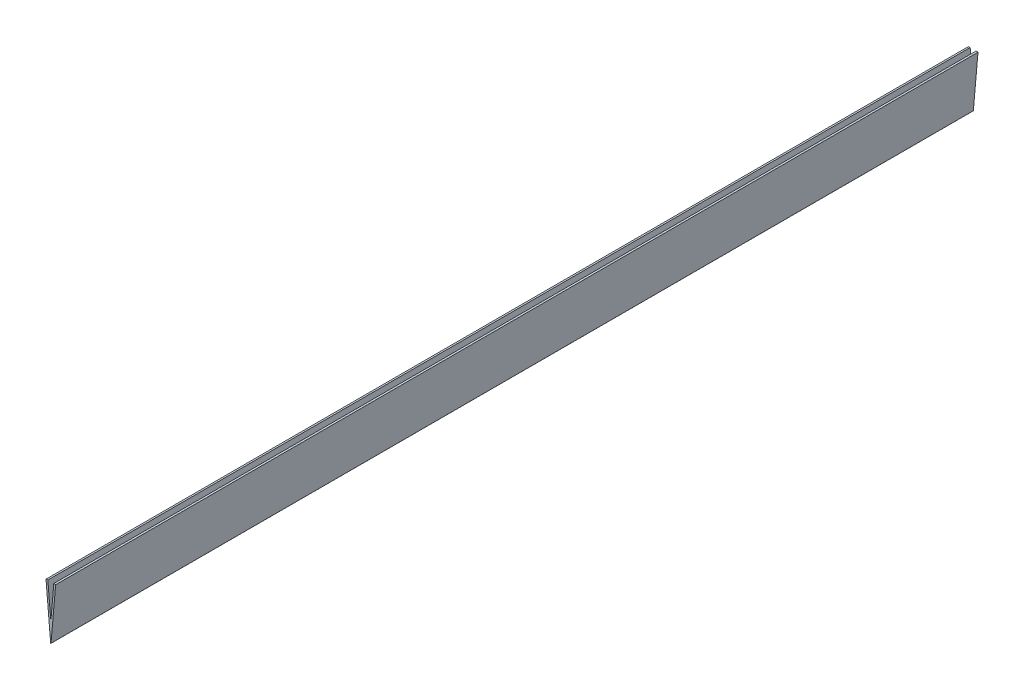
ISO-10303-21;
HEADER;
FILE_DESCRIPTION(('STEP AP214'),'2;1');
FILE_NAME('part.step','',(''),(''),'','','');
FILE_SCHEMA(('AUTOMOTIVE_DESIGN { 1 0 10303 214 1 1 1 1 }'));
ENDSEC;
DATA;
#1=APPLICATION_CONTEXT('core data for automotive mechanical design processes');
#2=APPLICATION_PROTOCOL_DEFINITION('international standard','automotive_design',2000,#1);
#3=PRODUCT_CONTEXT('',#1,'mechanical');
#4=PRODUCT('Part','Part','',(#3));
#5=PRODUCT_RELATED_PRODUCT_CATEGORY('part','',(#4));
#6=PRODUCT_DEFINITION_FORMATION('','',#4);
#7=PRODUCT_DEFINITION_CONTEXT('part definition',#1,'design');
#8=PRODUCT_DEFINITION('design','',#6,#7);
#9=PRODUCT_DEFINITION_SHAPE('','',#8);
#10=(LENGTH_UNIT() NAMED_UNIT(*) SI_UNIT(.MILLI.,.METRE.));
#11=(NAMED_UNIT(*) PLANE_ANGLE_UNIT() SI_UNIT($,.RADIAN.));
#12=(NAMED_UNIT(*) SI_UNIT($,.STERADIAN.) SOLID_ANGLE_UNIT());
#13=UNCERTAINTY_MEASURE_WITH_UNIT(LENGTH_MEASURE(1.E-05),#10,'distance_accuracy_value','');
#14=(GEOMETRIC_REPRESENTATION_CONTEXT(3) GLOBAL_UNCERTAINTY_ASSIGNED_CONTEXT((#13)) GLOBAL_UNIT_ASSIGNED_CONTEXT((#10,
#11,#12)) REPRESENTATION_CONTEXT('',''));
#15=CARTESIAN_POINT('',(0.,0.,0.));
#16=DIRECTION('',(0.,0.,1.));
#17=DIRECTION('',(1.,0.,0.));
#18=AXIS2_PLACEMENT_3D('',#15,#16,#17);
#19=CARTESIAN_POINT('',(-0.261467228242975,1.84121276970825,50.));
#20=DIRECTION('',(0.996194698091745,0.0871557427476585,0.));
#21=DIRECTION('',(-0.0871557427476585,0.996194698091746,0.));
#22=AXIS2_PLACEMENT_3D('',#19,#20,#21);
#23=PLANE('',#22);
#24=DIRECTION('',(0.0871557427476585,-0.996194698091746,0.));
#25=VECTOR('',#24,1.);
#26=CARTESIAN_POINT('',(-0.261467228242975,1.84121276970825,0.));
#27=LINE('',#26,#25);
#28=CARTESIAN_POINT('',(-0.261467228242975,1.84121276970825,0.));
#29=VERTEX_POINT('',#28);
#30=CARTESIAN_POINT('',(-0.00996194698091725,-1.03350574953776,0.));
#31=VERTEX_POINT('',#30);
#32=EDGE_CURVE('E141',#29,#31,#27,.T.);
#33=ORIENTED_EDGE('',*,*,#32,.T.);
#34=DIRECTION('',(0.,0.,-1.));
#35=VECTOR('',#34,1.);
#36=CARTESIAN_POINT('',(-0.00996194698091736,-1.03350574953776,50.));
#37=LINE('',#36,#35);
#38=CARTESIAN_POINT('',(-0.00996194698091725,-1.03350574953776,50.));
#39=VERTEX_POINT('',#38);
#40=EDGE_CURVE('E162',#31,#39,#37,.F.);
#41=ORIENTED_EDGE('',*,*,#40,.T.);
#42=DIRECTION('',(0.0871557427476585,-0.996194698091746,0.));
#43=VECTOR('',#42,1.);
#44=CARTESIAN_POINT('',(-0.261467228242975,1.84121276970825,50.));
#45=LINE('',#44,#43);
#46=CARTESIAN_POINT('',(-0.261467228242975,1.84121276970825,50.));
#47=VERTEX_POINT('',#46);
#48=EDGE_CURVE('E116',#47,#39,#45,.T.);
#49=ORIENTED_EDGE('',*,*,#48,.F.);
#50=DIRECTION('',(0.,0.,-1.));
#51=VECTOR('',#50,1.);
#52=CARTESIAN_POINT('',(-0.261467228242975,1.84121276970825,50.));
#53=LINE('',#52,#51);
#54=EDGE_CURVE('E140',#47,#29,#53,.T.);
#55=ORIENTED_EDGE('',*,*,#54,.T.);
#56=EDGE_LOOP('',(#33,#41,#49,#55));
#57=FACE_BOUND('',#56,.T.);
#58=ADVANCED_FACE('F41',(#57),#23,.F.);
#59=CARTESIAN_POINT('',(0.,-1.14737132456698,50.));
#60=DIRECTION('',(-0.996194698091745,0.0871557427476582,0.));
#61=DIRECTION('',(-0.0871557427476583,-0.996194698091746,0.));
#62=AXIS2_PLACEMENT_3D('',#59,#60,#61);
#63=PLANE('',#62);
#64=DIRECTION('',(0.0871557427476583,0.996194698091746,0.));
#65=VECTOR('',#64,1.);
#66=CARTESIAN_POINT('',(0.,-1.14737132456698,50.));
#67=LINE('',#66,#65);
#68=CARTESIAN_POINT('',(0.00996194698091756,-1.03350574953776,50.));
#69=VERTEX_POINT('',#68);
#70=CARTESIAN_POINT('',(0.261467228242975,1.84121276970825,50.));
#71=VERTEX_POINT('',#70);
#72=EDGE_CURVE('E104',#69,#71,#67,.T.);
#73=ORIENTED_EDGE('',*,*,#72,.F.);
#74=DIRECTION('',(0.,0.,-1.));
#75=VECTOR('',#74,1.);
#76=CARTESIAN_POINT('',(0.00996194698091756,-1.03350574953776,50.));
#77=LINE('',#76,#75);
#78=CARTESIAN_POINT('',(0.00996194698091756,-1.03350574953776,0.));
#79=VERTEX_POINT('',#78);
#80=EDGE_CURVE('E126',#69,#79,#77,.T.);
#81=ORIENTED_EDGE('',*,*,#80,.T.);
#82=DIRECTION('',(0.0871557427476583,0.996194698091746,0.));
#83=VECTOR('',#82,1.);
#84=CARTESIAN_POINT('',(0.,-1.14737132456698,0.));
#85=LINE('',#84,#83);
#86=CARTESIAN_POINT('',(0.261467228242975,1.84121276970825,0.));
#87=VERTEX_POINT('',#86);
#88=EDGE_CURVE('E122',#79,#87,#85,.T.);
#89=ORIENTED_EDGE('',*,*,#88,.T.);
#90=DIRECTION('',(0.,0.,-1.));
#91=VECTOR('',#90,1.);
#92=CARTESIAN_POINT('',(0.261467228242975,1.84121276970825,50.));
#93=LINE('',#92,#91);
#94=EDGE_CURVE('E119',#71,#87,#93,.T.);
#95=ORIENTED_EDGE('',*,*,#94,.F.);
#96=EDGE_LOOP('',(#73,#81,#89,#95));
#97=FACE_BOUND('',#96,.T.);
#98=ADVANCED_FACE('F120',(#97),#63,.F.);
#99=CARTESIAN_POINT('',(0.261467228242975,1.84121276970825,50.));
#100=DIRECTION('',(-0.0871557427476583,-0.996194698091746,0.));
#101=DIRECTION('',(0.996194698091746,-0.0871557427476583,0.));
#102=AXIS2_PLACEMENT_3D('',#99,#100,#101);
#103=PLANE('',#102);
#104=DIRECTION('',(-0.996194698091746,0.0871557427476583,0.));
#105=VECTOR('',#104,1.);
#106=CARTESIAN_POINT('',(0.261467228242975,1.84121276970825,0.));
#107=LINE('',#106,#105);
#108=CARTESIAN_POINT('',(0.1618477584338,1.84992834398302,0.));
#109=VERTEX_POINT('',#108);
#110=EDGE_CURVE('E145',#87,#109,#107,.T.);
#111=ORIENTED_EDGE('',*,*,#110,.T.);
#112=DIRECTION('',(0.,0.,-1.));
#113=VECTOR('',#112,1.);
#114=CARTESIAN_POINT('',(0.1618477584338,1.84992834398302,50.));
#115=LINE('',#114,#113);
#116=CARTESIAN_POINT('',(0.1618477584338,1.84992834398302,50.));
#117=VERTEX_POINT('',#116);
#118=EDGE_CURVE('E127',#117,#109,#115,.T.);
#119=ORIENTED_EDGE('',*,*,#118,.F.);
#120=DIRECTION('',(-0.996194698091746,0.0871557427476583,0.));
#121=VECTOR('',#120,1.);
#122=CARTESIAN_POINT('',(0.261467228242975,1.84121276970825,50.));
#123=LINE('',#122,#121);
#124=EDGE_CURVE('E109',#71,#117,#123,.T.);
#125=ORIENTED_EDGE('',*,*,#124,.F.);
#126=ORIENTED_EDGE('',*,*,#94,.T.);
#127=EDGE_LOOP('',(#111,#119,#125,#126));
#128=FACE_BOUND('',#127,.T.);
#129=ADVANCED_FACE('F129',(#128),#103,.F.);
#130=CARTESIAN_POINT('',(0.,0.,50.));
#131=DIRECTION('',(-0.996194698091746,0.0871557427476582,0.));
#132=DIRECTION('',(-0.0871557427476582,-0.996194698091746,0.));
#133=AXIS2_PLACEMENT_3D('',#130,#131,#132);
#134=PLANE('',#133);
#135=DIRECTION('',(0.0871557427476582,0.996194698091746,0.));
#136=VECTOR('',#135,1.);
#137=CARTESIAN_POINT('',(0.,0.,0.));
#138=LINE('',#137,#136);
#139=CARTESIAN_POINT('',(0.00996194698091744,0.113865575029222,0.));
#140=VERTEX_POINT('',#139);
#141=EDGE_CURVE('E147',#140,#109,#138,.T.);
#142=ORIENTED_EDGE('',*,*,#141,.F.);
#143=DIRECTION('',(0.,0.,-1.));
#144=VECTOR('',#143,1.);
#145=CARTESIAN_POINT('',(0.00996194698091743,0.113865575029222,50.));
#146=LINE('',#145,#144);
#147=CARTESIAN_POINT('',(0.00996194698091744,0.113865575029222,50.));
#148=VERTEX_POINT('',#147);
#149=EDGE_CURVE('E62',#140,#148,#146,.F.);
#150=ORIENTED_EDGE('',*,*,#149,.T.);
#151=DIRECTION('',(0.0871557427476582,0.996194698091746,0.));
#152=VECTOR('',#151,1.);
#153=CARTESIAN_POINT('',(0.,0.,50.));
#154=LINE('',#153,#152);
#155=EDGE_CURVE('E131',#148,#117,#154,.T.);
#156=ORIENTED_EDGE('',*,*,#155,.T.);
#157=ORIENTED_EDGE('',*,*,#118,.T.);
#158=EDGE_LOOP('',(#142,#150,#156,#157));
#159=FACE_BOUND('',#158,.T.);
#160=ADVANCED_FACE('F174',(#159),#134,.T.);
#161=CARTESIAN_POINT('',(0.,0.,50.));
#162=DIRECTION('',(-0.996194698091746,-0.0871557427476586,0.));
#163=DIRECTION('',(0.0871557427476586,-0.996194698091746,0.));
#164=AXIS2_PLACEMENT_3D('',#161,#162,#163);
#165=PLANE('',#164);
#166=DIRECTION('',(-0.0871557427476586,0.996194698091746,0.));
#167=VECTOR('',#166,1.);
#168=CARTESIAN_POINT('',(0.,0.,50.));
#169=LINE('',#168,#167);
#170=CARTESIAN_POINT('',(-0.00996194698091748,0.113865575029222,50.));
#171=VERTEX_POINT('',#170);
#172=CARTESIAN_POINT('',(-0.161847758433801,1.84992834398302,50.));
#173=VERTEX_POINT('',#172);
#174=EDGE_CURVE('E133',#171,#173,#169,.T.);
#175=ORIENTED_EDGE('',*,*,#174,.F.);
#176=DIRECTION('',(0.,0.,-1.));
#177=VECTOR('',#176,1.);
#178=CARTESIAN_POINT('',(-0.00996194698091748,0.113865575029222,50.));
#179=LINE('',#178,#177);
#180=CARTESIAN_POINT('',(-0.00996194698091748,0.113865575029222,0.));
#181=VERTEX_POINT('',#180);
#182=EDGE_CURVE('E165',#171,#181,#179,.T.);
#183=ORIENTED_EDGE('',*,*,#182,.T.);
#184=DIRECTION('',(-0.0871557427476586,0.996194698091746,0.));
#185=VECTOR('',#184,1.);
#186=CARTESIAN_POINT('',(0.,0.,0.));
#187=LINE('',#186,#185);
#188=CARTESIAN_POINT('',(-0.161847758433801,1.84992834398302,0.));
#189=VERTEX_POINT('',#188);
#190=EDGE_CURVE('E149',#181,#189,#187,.T.);
#191=ORIENTED_EDGE('',*,*,#190,.T.);
#192=DIRECTION('',(0.,0.,-1.));
#193=VECTOR('',#192,1.);
#194=CARTESIAN_POINT('',(-0.161847758433801,1.84992834398302,50.));
#195=LINE('',#194,#193);
#196=EDGE_CURVE('E155',#173,#189,#195,.T.);
#197=ORIENTED_EDGE('',*,*,#196,.F.);
#198=EDGE_LOOP('',(#175,#183,#191,#197));
#199=FACE_BOUND('',#198,.T.);
#200=ADVANCED_FACE('F176',(#199),#165,.F.);
#201=CARTESIAN_POINT('',(-0.161847758433801,1.84992834398302,50.));
#202=DIRECTION('',(0.0871557427476585,-0.996194698091746,0.));
#203=DIRECTION('',(0.996194698091746,0.0871557427476585,0.));
#204=AXIS2_PLACEMENT_3D('',#201,#202,#203);
#205=PLANE('',#204);
#206=DIRECTION('',(-0.996194698091745,-0.0871557427476585,0.));
#207=VECTOR('',#206,1.);
#208=CARTESIAN_POINT('',(-0.161847758433801,1.84992834398302,0.));
#209=LINE('',#208,#207);
#210=EDGE_CURVE('E151',#189,#29,#209,.T.);
#211=ORIENTED_EDGE('',*,*,#210,.T.);
#212=ORIENTED_EDGE('',*,*,#54,.F.);
#213=DIRECTION('',(-0.996194698091745,-0.0871557427476585,0.));
#214=VECTOR('',#213,1.);
#215=CARTESIAN_POINT('',(-0.161847758433801,1.84992834398302,50.));
#216=LINE('',#215,#214);
#217=EDGE_CURVE('E138',#173,#47,#216,.T.);
#218=ORIENTED_EDGE('',*,*,#217,.F.);
#219=ORIENTED_EDGE('',*,*,#196,.T.);
#220=EDGE_LOOP('',(#211,#212,#218,#219));
#221=FACE_BOUND('',#220,.T.);
#222=ADVANCED_FACE('F182',(#221),#205,.F.);
#223=CARTESIAN_POINT('',(0.,0.,50.));
#224=DIRECTION('',(0.,0.,-1.));
#225=DIRECTION('',(-1.,0.,0.));
#226=AXIS2_PLACEMENT_3D('',#223,#224,#225);
#227=PLANE('',#226);
#228=ORIENTED_EDGE('',*,*,#48,.T.);
#229=CARTESIAN_POINT('',(0.,-1.03263419211028,50.));
#230=DIRECTION('',(0.,0.,-1.));
#231=DIRECTION('',(-1.,0.,0.));
#232=AXIS2_PLACEMENT_3D('',#229,#230,#231);
#233=CIRCLE('',#232,0.01);
#234=EDGE_CURVE('E112',#39,#69,#233,.F.);
#235=ORIENTED_EDGE('',*,*,#234,.T.);
#236=ORIENTED_EDGE('',*,*,#72,.T.);
#237=ORIENTED_EDGE('',*,*,#124,.T.);
#238=ORIENTED_EDGE('',*,*,#155,.F.);
#239=CARTESIAN_POINT('',(0.,0.114737132456698,50.));
#240=DIRECTION('',(0.,0.,-1.));
#241=DIRECTION('',(-1.,0.,0.));
#242=AXIS2_PLACEMENT_3D('',#239,#240,#241);
#243=CIRCLE('',#242,0.01);
#244=EDGE_CURVE('E11',#148,#171,#243,.T.);
#245=ORIENTED_EDGE('',*,*,#244,.T.);
#246=ORIENTED_EDGE('',*,*,#174,.T.);
#247=ORIENTED_EDGE('',*,*,#217,.T.);
#248=EDGE_LOOP('',(#228,#235,#236,#237,#238,#245,#246,#247));
#249=FACE_BOUND('',#248,.T.);
#250=ADVANCED_FACE('F107',(#249),#227,.F.);
#251=CARTESIAN_POINT('',(0.,0.,0.));
#252=DIRECTION('',(0.,0.,-1.));
#253=DIRECTION('',(-1.,0.,0.));
#254=AXIS2_PLACEMENT_3D('',#251,#252,#253);
#255=PLANE('',#254);
#256=ORIENTED_EDGE('',*,*,#88,.F.);
#257=CARTESIAN_POINT('',(0.,-1.03263419211028,0.));
#258=DIRECTION('',(0.,0.,-1.));
#259=DIRECTION('',(-1.,0.,0.));
#260=AXIS2_PLACEMENT_3D('',#257,#258,#259);
#261=CIRCLE('',#260,0.01);
#262=EDGE_CURVE('E160',#79,#31,#261,.T.);
#263=ORIENTED_EDGE('',*,*,#262,.T.);
#264=ORIENTED_EDGE('',*,*,#32,.F.);
#265=ORIENTED_EDGE('',*,*,#210,.F.);
#266=ORIENTED_EDGE('',*,*,#190,.F.);
#267=CARTESIAN_POINT('',(0.,0.114737132456698,0.));
#268=DIRECTION('',(0.,0.,-1.));
#269=DIRECTION('',(-1.,0.,0.));
#270=AXIS2_PLACEMENT_3D('',#267,#268,#269);
#271=CIRCLE('',#270,0.01);
#272=EDGE_CURVE('E49',#181,#140,#271,.F.);
#273=ORIENTED_EDGE('',*,*,#272,.T.);
#274=ORIENTED_EDGE('',*,*,#141,.T.);
#275=ORIENTED_EDGE('',*,*,#110,.F.);
#276=EDGE_LOOP('',(#256,#263,#264,#265,#266,#273,#274,#275));
#277=FACE_BOUND('',#276,.T.);
#278=ADVANCED_FACE('F170',(#277),#255,.T.);
#279=CARTESIAN_POINT('',(0.,-1.03263419211028,50.));
#280=DIRECTION('',(0.,0.,-1.));
#281=DIRECTION('',(-1.,0.,0.));
#282=AXIS2_PLACEMENT_3D('',#279,#280,#281);
#283=CYLINDRICAL_SURFACE('',#282,0.01);
#284=ORIENTED_EDGE('',*,*,#234,.F.);
#285=ORIENTED_EDGE('',*,*,#40,.F.);
#286=ORIENTED_EDGE('',*,*,#262,.F.);
#287=ORIENTED_EDGE('',*,*,#80,.F.);
#288=EDGE_LOOP('',(#284,#285,#286,#287));
#289=FACE_BOUND('',#288,.T.);
#290=ADVANCED_FACE('F187',(#289),#283,.T.);
#291=CARTESIAN_POINT('',(0.,0.114737132456698,50.));
#292=DIRECTION('',(0.,0.,-1.));
#293=DIRECTION('',(-1.,0.,0.));
#294=AXIS2_PLACEMENT_3D('',#291,#292,#293);
#295=CYLINDRICAL_SURFACE('',#294,0.01);
#296=ORIENTED_EDGE('',*,*,#244,.F.);
#297=ORIENTED_EDGE('',*,*,#149,.F.);
#298=ORIENTED_EDGE('',*,*,#272,.F.);
#299=ORIENTED_EDGE('',*,*,#182,.F.);
#300=EDGE_LOOP('',(#296,#297,#298,#299));
#301=FACE_BOUND('',#300,.T.);
#302=ADVANCED_FACE('F43',(#301),#295,.F.);
#303=CLOSED_SHELL('',(#58,#98,#129,#160,#200,#222,#250,#278,#290,#302));
#304=MANIFOLD_SOLID_BREP('B2',#303);
#305=ADVANCED_BREP_SHAPE_REPRESENTATION('',(#18,#304),#14);
#306=SHAPE_DEFINITION_REPRESENTATION(#9,#305);
ENDSEC;
END-ISO-10303-21;
